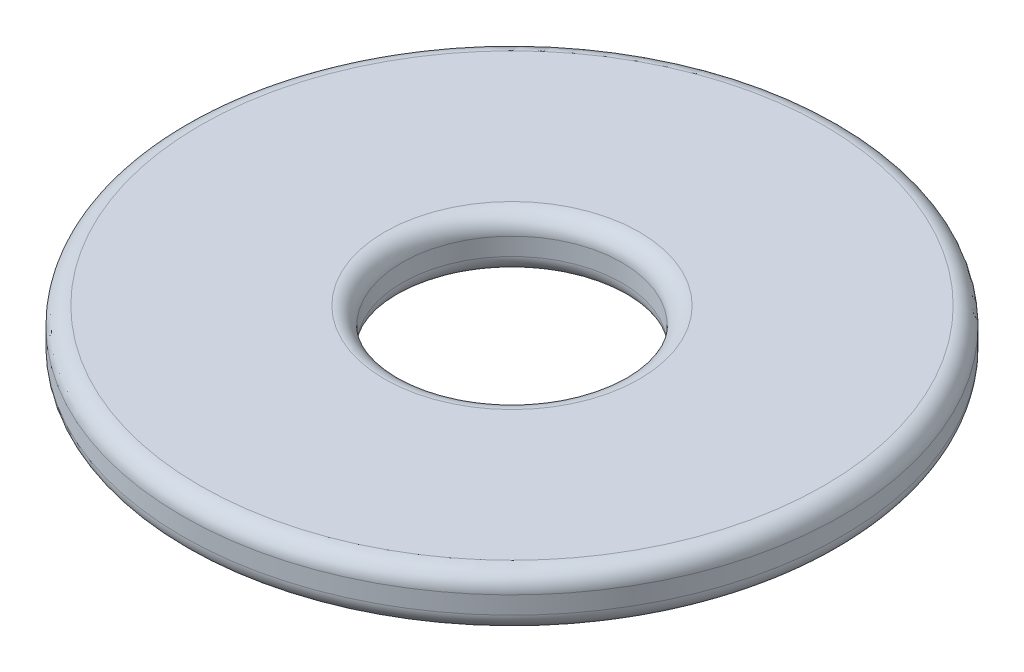
ISO-10303-21;
HEADER;
FILE_DESCRIPTION(('STEP AP214'),'2;1');
FILE_NAME('part.step','',(''),(''),'','','');
FILE_SCHEMA(('AUTOMOTIVE_DESIGN { 1 0 10303 214 1 1 1 1 }'));
ENDSEC;
DATA;
#1=APPLICATION_CONTEXT('core data for automotive mechanical design processes');
#2=APPLICATION_PROTOCOL_DEFINITION('international standard','automotive_design',2000,#1);
#3=PRODUCT_CONTEXT('',#1,'mechanical');
#4=PRODUCT('Part','Part','',(#3));
#5=PRODUCT_RELATED_PRODUCT_CATEGORY('part','',(#4));
#6=PRODUCT_DEFINITION_FORMATION('','',#4);
#7=PRODUCT_DEFINITION_CONTEXT('part definition',#1,'design');
#8=PRODUCT_DEFINITION('design','',#6,#7);
#9=PRODUCT_DEFINITION_SHAPE('','',#8);
#10=(LENGTH_UNIT() NAMED_UNIT(*) SI_UNIT(.MILLI.,.METRE.));
#11=(NAMED_UNIT(*) PLANE_ANGLE_UNIT() SI_UNIT($,.RADIAN.));
#12=(NAMED_UNIT(*) SI_UNIT($,.STERADIAN.) SOLID_ANGLE_UNIT());
#13=UNCERTAINTY_MEASURE_WITH_UNIT(LENGTH_MEASURE(1.E-05),#10,'distance_accuracy_value','');
#14=(GEOMETRIC_REPRESENTATION_CONTEXT(3) GLOBAL_UNCERTAINTY_ASSIGNED_CONTEXT((#13)) GLOBAL_UNIT_ASSIGNED_CONTEXT((#10,
#11,#12)) REPRESENTATION_CONTEXT('',''));
#15=CARTESIAN_POINT('',(0.,0.,0.));
#16=DIRECTION('',(0.,0.,1.));
#17=DIRECTION('',(1.,0.,0.));
#18=AXIS2_PLACEMENT_3D('',#15,#16,#17);
#19=CARTESIAN_POINT('',(0.,1.2,0.));
#20=DIRECTION('',(0.,1.,0.));
#21=DIRECTION('',(0.,0.,1.));
#22=AXIS2_PLACEMENT_3D('',#19,#20,#21);
#23=PLANE('',#22);
#24=CARTESIAN_POINT('',(0.,1.2,0.));
#25=DIRECTION('',(0.,1.,0.));
#26=DIRECTION('',(0.,0.,1.));
#27=AXIS2_PLACEMENT_3D('',#24,#25,#26);
#28=CIRCLE('',#27,2.9);
#29=CARTESIAN_POINT('',(0.,1.2,2.9));
#30=VERTEX_POINT('',#29);
#31=EDGE_CURVE('E48',#30,#30,#28,.F.);
#32=ORIENTED_EDGE('',*,*,#31,.T.);
#33=EDGE_LOOP('',(#32));
#34=FACE_BOUND('',#33,.T.);
#35=CARTESIAN_POINT('',(0.,1.2,0.));
#36=DIRECTION('',(0.,1.,0.));
#37=DIRECTION('',(0.,0.,1.));
#38=AXIS2_PLACEMENT_3D('',#35,#36,#37);
#39=CIRCLE('',#38,7.1);
#40=CARTESIAN_POINT('',(0.,1.2,7.1));
#41=VERTEX_POINT('',#40);
#42=EDGE_CURVE('E52',#41,#41,#39,.T.);
#43=ORIENTED_EDGE('',*,*,#42,.T.);
#44=EDGE_LOOP('',(#43));
#45=FACE_BOUND('',#44,.T.);
#46=ADVANCED_FACE('F37',(#34,#45),#23,.T.);
#47=CARTESIAN_POINT('',(0.,0.,0.));
#48=DIRECTION('',(0.,1.,0.));
#49=DIRECTION('',(0.,0.,1.));
#50=AXIS2_PLACEMENT_3D('',#47,#48,#49);
#51=PLANE('',#50);
#52=CARTESIAN_POINT('',(0.,0.,0.));
#53=DIRECTION('',(0.,1.,0.));
#54=DIRECTION('',(0.,0.,1.));
#55=AXIS2_PLACEMENT_3D('',#52,#53,#54);
#56=CIRCLE('',#55,2.9);
#57=CARTESIAN_POINT('',(0.,0.,2.9));
#58=VERTEX_POINT('',#57);
#59=EDGE_CURVE('E63',#58,#58,#56,.T.);
#60=ORIENTED_EDGE('',*,*,#59,.T.);
#61=EDGE_LOOP('',(#60));
#62=FACE_BOUND('',#61,.T.);
#63=CARTESIAN_POINT('',(0.,0.,0.));
#64=DIRECTION('',(0.,1.,0.));
#65=DIRECTION('',(0.,0.,1.));
#66=AXIS2_PLACEMENT_3D('',#63,#64,#65);
#67=CIRCLE('',#66,7.1);
#68=CARTESIAN_POINT('',(0.,0.,7.1));
#69=VERTEX_POINT('',#68);
#70=EDGE_CURVE('E66',#69,#69,#67,.F.);
#71=ORIENTED_EDGE('',*,*,#70,.T.);
#72=EDGE_LOOP('',(#71));
#73=FACE_BOUND('',#72,.T.);
#74=ADVANCED_FACE('F70',(#62,#73),#51,.F.);
#75=CARTESIAN_POINT('',(0.,1.2,0.));
#76=DIRECTION('',(0.,-1.,0.));
#77=DIRECTION('',(0.,0.,-1.));
#78=AXIS2_PLACEMENT_3D('',#75,#76,#77);
#79=CYLINDRICAL_SURFACE('',#78,7.5);
#80=CARTESIAN_POINT('',(0.,0.4,0.));
#81=DIRECTION('',(0.,1.,0.));
#82=DIRECTION('',(0.,0.,1.));
#83=AXIS2_PLACEMENT_3D('',#80,#81,#82);
#84=CIRCLE('',#83,7.5);
#85=CARTESIAN_POINT('',(0.,0.4,7.5));
#86=VERTEX_POINT('',#85);
#87=EDGE_CURVE('E10',#86,#86,#84,.T.);
#88=ORIENTED_EDGE('',*,*,#87,.T.);
#89=EDGE_LOOP('',(#88));
#90=FACE_BOUND('',#89,.T.);
#91=CARTESIAN_POINT('',(0.,0.8,0.));
#92=DIRECTION('',(0.,1.,0.));
#93=DIRECTION('',(0.,0.,1.));
#94=AXIS2_PLACEMENT_3D('',#91,#92,#93);
#95=CIRCLE('',#94,7.5);
#96=CARTESIAN_POINT('',(0.,0.8,7.5));
#97=VERTEX_POINT('',#96);
#98=EDGE_CURVE('E44',#97,#97,#95,.F.);
#99=ORIENTED_EDGE('',*,*,#98,.T.);
#100=EDGE_LOOP('',(#99));
#101=FACE_BOUND('',#100,.T.);
#102=ADVANCED_FACE('F90',(#90,#101),#79,.T.);
#103=CARTESIAN_POINT('',(0.,1.2,0.));
#104=DIRECTION('',(0.,-1.,0.));
#105=DIRECTION('',(0.,0.,-1.));
#106=AXIS2_PLACEMENT_3D('',#103,#104,#105);
#107=CYLINDRICAL_SURFACE('',#106,2.5);
#108=CARTESIAN_POINT('',(0.,0.4,0.));
#109=DIRECTION('',(0.,1.,0.));
#110=DIRECTION('',(0.,0.,1.));
#111=AXIS2_PLACEMENT_3D('',#108,#109,#110);
#112=CIRCLE('',#111,2.5);
#113=CARTESIAN_POINT('',(0.,0.4,2.5));
#114=VERTEX_POINT('',#113);
#115=EDGE_CURVE('E57',#114,#114,#112,.F.);
#116=ORIENTED_EDGE('',*,*,#115,.T.);
#117=EDGE_LOOP('',(#116));
#118=FACE_BOUND('',#117,.T.);
#119=CARTESIAN_POINT('',(0.,0.8,0.));
#120=DIRECTION('',(0.,1.,0.));
#121=DIRECTION('',(0.,0.,1.));
#122=AXIS2_PLACEMENT_3D('',#119,#120,#121);
#123=CIRCLE('',#122,2.5);
#124=CARTESIAN_POINT('',(0.,0.8,2.5));
#125=VERTEX_POINT('',#124);
#126=EDGE_CURVE('E60',#125,#125,#123,.T.);
#127=ORIENTED_EDGE('',*,*,#126,.T.);
#128=EDGE_LOOP('',(#127));
#129=FACE_BOUND('',#128,.T.);
#130=ADVANCED_FACE('F95',(#118,#129),#107,.F.);
#131=CARTESIAN_POINT('',(0.,0.4,0.));
#132=DIRECTION('',(0.,1.,0.));
#133=DIRECTION('',(0.,0.,1.));
#134=AXIS2_PLACEMENT_3D('',#131,#132,#133);
#135=TOROIDAL_SURFACE('',#134,2.9,0.4);
#136=ORIENTED_EDGE('',*,*,#115,.F.);
#137=EDGE_LOOP('',(#136));
#138=FACE_BOUND('',#137,.T.);
#139=ORIENTED_EDGE('',*,*,#59,.F.);
#140=EDGE_LOOP('',(#139));
#141=FACE_BOUND('',#140,.T.);
#142=ADVANCED_FACE('F81',(#138,#141),#135,.T.);
#143=CARTESIAN_POINT('',(0.,0.8,0.));
#144=DIRECTION('',(0.,1.,0.));
#145=DIRECTION('',(0.,0.,1.));
#146=AXIS2_PLACEMENT_3D('',#143,#144,#145);
#147=TOROIDAL_SURFACE('',#146,2.9,0.4);
#148=ORIENTED_EDGE('',*,*,#31,.F.);
#149=EDGE_LOOP('',(#148));
#150=FACE_BOUND('',#149,.T.);
#151=ORIENTED_EDGE('',*,*,#126,.F.);
#152=EDGE_LOOP('',(#151));
#153=FACE_BOUND('',#152,.T.);
#154=ADVANCED_FACE('F75',(#150,#153),#147,.T.);
#155=CARTESIAN_POINT('',(0.,0.4,0.));
#156=DIRECTION('',(0.,1.,0.));
#157=DIRECTION('',(0.,0.,1.));
#158=AXIS2_PLACEMENT_3D('',#155,#156,#157);
#159=TOROIDAL_SURFACE('',#158,7.1,0.4);
#160=ORIENTED_EDGE('',*,*,#70,.F.);
#161=EDGE_LOOP('',(#160));
#162=FACE_BOUND('',#161,.T.);
#163=ORIENTED_EDGE('',*,*,#87,.F.);
#164=EDGE_LOOP('',(#163));
#165=FACE_BOUND('',#164,.T.);
#166=ADVANCED_FACE('F72',(#162,#165),#159,.T.);
#167=CARTESIAN_POINT('',(0.,0.8,0.));
#168=DIRECTION('',(0.,1.,0.));
#169=DIRECTION('',(0.,0.,1.));
#170=AXIS2_PLACEMENT_3D('',#167,#168,#169);
#171=TOROIDAL_SURFACE('',#170,7.1,0.4);
#172=ORIENTED_EDGE('',*,*,#98,.F.);
#173=EDGE_LOOP('',(#172));
#174=FACE_BOUND('',#173,.T.);
#175=ORIENTED_EDGE('',*,*,#42,.F.);
#176=EDGE_LOOP('',(#175));
#177=FACE_BOUND('',#176,.T.);
#178=ADVANCED_FACE('F39',(#174,#177),#171,.T.);
#179=CLOSED_SHELL('',(#46,#74,#102,#130,#142,#154,#166,#178));
#180=MANIFOLD_SOLID_BREP('B2',#179);
#181=ADVANCED_BREP_SHAPE_REPRESENTATION('',(#18,#180),#14);
#182=SHAPE_DEFINITION_REPRESENTATION(#9,#181);
ENDSEC;
END-ISO-10303-21;
